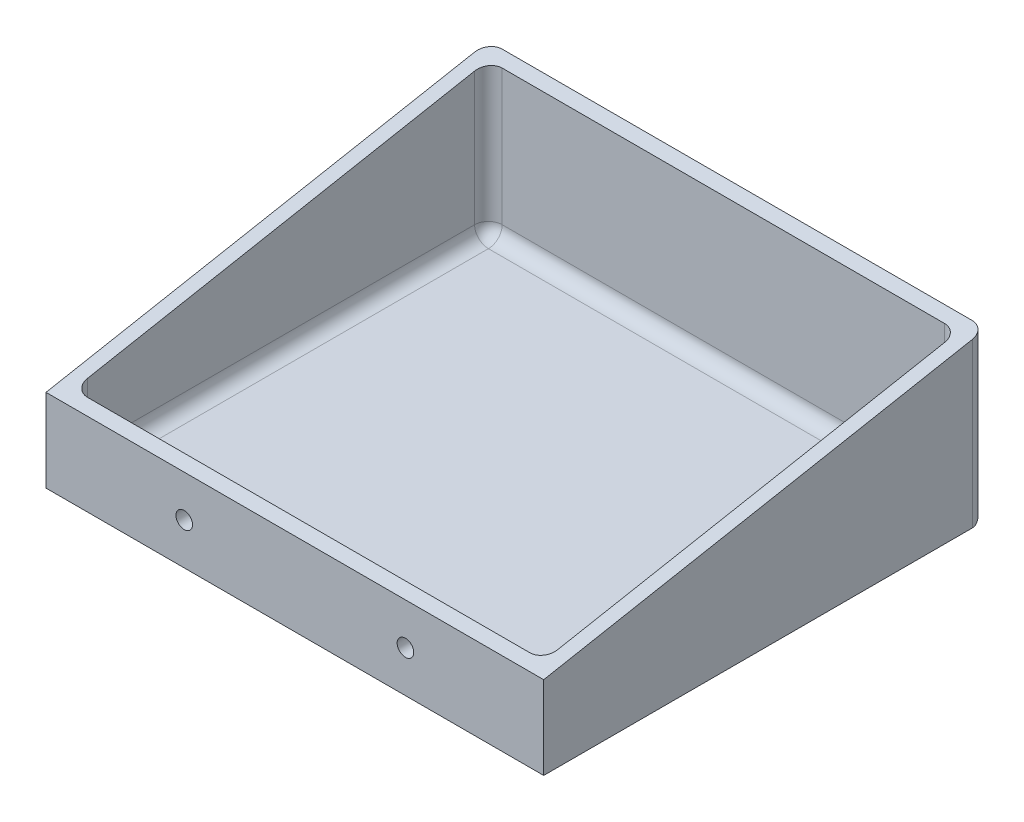
ISO-10303-21;
HEADER;
FILE_DESCRIPTION(('STEP AP214'),'2;1');
FILE_NAME('part.step','',(''),(''),'','','');
FILE_SCHEMA(('AUTOMOTIVE_DESIGN { 1 0 10303 214 1 1 1 1 }'));
ENDSEC;
DATA;
#1=APPLICATION_CONTEXT('core data for automotive mechanical design processes');
#2=APPLICATION_PROTOCOL_DEFINITION('international standard','automotive_design',2000,#1);
#3=PRODUCT_CONTEXT('',#1,'mechanical');
#4=PRODUCT('Part','Part','',(#3));
#5=PRODUCT_RELATED_PRODUCT_CATEGORY('part','',(#4));
#6=PRODUCT_DEFINITION_FORMATION('','',#4);
#7=PRODUCT_DEFINITION_CONTEXT('part definition',#1,'design');
#8=PRODUCT_DEFINITION('design','',#6,#7);
#9=PRODUCT_DEFINITION_SHAPE('','',#8);
#10=(LENGTH_UNIT() NAMED_UNIT(*) SI_UNIT(.MILLI.,.METRE.));
#11=(NAMED_UNIT(*) PLANE_ANGLE_UNIT() SI_UNIT($,.RADIAN.));
#12=(NAMED_UNIT(*) SI_UNIT($,.STERADIAN.) SOLID_ANGLE_UNIT());
#13=UNCERTAINTY_MEASURE_WITH_UNIT(LENGTH_MEASURE(1.E-05),#10,'distance_accuracy_value','');
#14=(GEOMETRIC_REPRESENTATION_CONTEXT(3) GLOBAL_UNCERTAINTY_ASSIGNED_CONTEXT((#13)) GLOBAL_UNIT_ASSIGNED_CONTEXT((#10,
#11,#12)) REPRESENTATION_CONTEXT('',''));
#15=CARTESIAN_POINT('',(0.,0.,0.));
#16=DIRECTION('',(0.,0.,1.));
#17=DIRECTION('',(1.,0.,0.));
#18=AXIS2_PLACEMENT_3D('',#15,#16,#17);
#19=CARTESIAN_POINT('',(90.,15.,0.));
#20=DIRECTION('',(0.,0.,-1.));
#21=DIRECTION('',(0.,1.,0.));
#22=AXIS2_PLACEMENT_3D('',#19,#20,#21);
#23=PLANE('',#22);
#24=DIRECTION('',(0.,-1.,0.));
#25=VECTOR('',#24,1.);
#26=CARTESIAN_POINT('',(0.,15.,0.));
#27=LINE('',#26,#25);
#28=CARTESIAN_POINT('',(0.,15.,0.));
#29=VERTEX_POINT('',#28);
#30=CARTESIAN_POINT('',(0.,0.,0.));
#31=VERTEX_POINT('',#30);
#32=EDGE_CURVE('E184',#29,#31,#27,.T.);
#33=ORIENTED_EDGE('',*,*,#32,.T.);
#34=DIRECTION('',(-1.,0.,0.));
#35=VECTOR('',#34,1.);
#36=CARTESIAN_POINT('',(90.,0.,0.));
#37=LINE('',#36,#35);
#38=CARTESIAN_POINT('',(90.,0.,0.));
#39=VERTEX_POINT('',#38);
#40=EDGE_CURVE('E166',#39,#31,#37,.T.);
#41=ORIENTED_EDGE('',*,*,#40,.F.);
#42=DIRECTION('',(0.,-1.,0.));
#43=VECTOR('',#42,1.);
#44=CARTESIAN_POINT('',(90.,15.,0.));
#45=LINE('',#44,#43);
#46=CARTESIAN_POINT('',(90.,15.,0.));
#47=VERTEX_POINT('',#46);
#48=EDGE_CURVE('E172',#47,#39,#45,.T.);
#49=ORIENTED_EDGE('',*,*,#48,.F.);
#50=DIRECTION('',(-1.,0.,0.));
#51=VECTOR('',#50,1.);
#52=CARTESIAN_POINT('',(90.,15.,0.));
#53=LINE('',#52,#51);
#54=EDGE_CURVE('E193',#47,#29,#53,.T.);
#55=ORIENTED_EDGE('',*,*,#54,.T.);
#56=EDGE_LOOP('',(#33,#41,#49,#55));
#57=FACE_BOUND('',#56,.T.);
#58=CARTESIAN_POINT('',(65.,7.5,0.));
#59=DIRECTION('',(0.,0.,1.));
#60=DIRECTION('',(1.,0.,0.));
#61=AXIS2_PLACEMENT_3D('',#58,#59,#60);
#62=CIRCLE('',#61,1.5);
#63=CARTESIAN_POINT('',(66.5,7.5,0.));
#64=VERTEX_POINT('',#63);
#65=EDGE_CURVE('E330',#64,#64,#62,.T.);
#66=ORIENTED_EDGE('',*,*,#65,.F.);
#67=EDGE_LOOP('',(#66));
#68=FACE_BOUND('',#67,.T.);
#69=CARTESIAN_POINT('',(25.,7.5,0.));
#70=DIRECTION('',(0.,0.,1.));
#71=DIRECTION('',(1.,0.,0.));
#72=AXIS2_PLACEMENT_3D('',#69,#70,#71);
#73=CIRCLE('',#72,1.5);
#74=CARTESIAN_POINT('',(26.5,7.5,0.));
#75=VERTEX_POINT('',#74);
#76=EDGE_CURVE('E677',#75,#75,#73,.T.);
#77=ORIENTED_EDGE('',*,*,#76,.F.);
#78=EDGE_LOOP('',(#77));
#79=FACE_BOUND('',#78,.T.);
#80=ADVANCED_FACE('F45',(#57,#68,#79),#23,.F.);
#81=CARTESIAN_POINT('',(90.,30.,-80.));
#82=DIRECTION('',(0.,-0.982872186934322,-0.184288535050185));
#83=DIRECTION('',(0.,0.184288535050185,-0.982872186934322));
#84=AXIS2_PLACEMENT_3D('',#81,#82,#83);
#85=PLANE('',#84);
#86=DIRECTION('',(-1.,0.,0.));
#87=VECTOR('',#86,1.);
#88=CARTESIAN_POINT('',(90.,30.,-80.));
#89=LINE('',#88,#87);
#90=CARTESIAN_POINT('',(87.5,30.,-80.));
#91=VERTEX_POINT('',#90);
#92=CARTESIAN_POINT('',(2.50000000000003,30.,-80.));
#93=VERTEX_POINT('',#92);
#94=EDGE_CURVE('E187',#91,#93,#89,.T.);
#95=ORIENTED_EDGE('',*,*,#94,.T.);
#96=CARTESIAN_POINT('',(2.5,29.53125,-77.5));
#97=DIRECTION('',(0.,-0.982872186934322,-0.184288535050185));
#98=DIRECTION('',(0.,0.184288535050185,-0.982872186934322));
#99=AXIS2_PLACEMENT_3D('',#96,#97,#98);
#100=ELLIPSE('',#99,2.54356571814058,2.5);
#101=CARTESIAN_POINT('',(0.,29.53125,-77.5));
#102=VERTEX_POINT('',#101);
#103=EDGE_CURVE('E71',#93,#102,#100,.F.);
#104=ORIENTED_EDGE('',*,*,#103,.T.);
#105=DIRECTION('',(0.,-0.184288535050185,0.982872186934322));
#106=VECTOR('',#105,1.);
#107=CARTESIAN_POINT('',(0.,30.,-80.));
#108=LINE('',#107,#106);
#109=EDGE_CURVE('E180',#102,#29,#108,.T.);
#110=ORIENTED_EDGE('',*,*,#109,.T.);
#111=ORIENTED_EDGE('',*,*,#54,.F.);
#112=DIRECTION('',(0.,-0.184288535050185,0.982872186934322));
#113=VECTOR('',#112,1.);
#114=CARTESIAN_POINT('',(90.,30.,-80.));
#115=LINE('',#114,#113);
#116=CARTESIAN_POINT('',(90.,29.53125,-77.5));
#117=VERTEX_POINT('',#116);
#118=EDGE_CURVE('E171',#117,#47,#115,.T.);
#119=ORIENTED_EDGE('',*,*,#118,.F.);
#120=CARTESIAN_POINT('',(87.5,29.53125,-77.5));
#121=DIRECTION('',(0.,-0.982872186934322,-0.184288535050185));
#122=DIRECTION('',(0.,-0.184288535050185,0.982872186934322));
#123=AXIS2_PLACEMENT_3D('',#120,#121,#122);
#124=ELLIPSE('',#123,2.54356571814058,2.5);
#125=EDGE_CURVE('E255',#117,#91,#124,.F.);
#126=ORIENTED_EDGE('',*,*,#125,.T.);
#127=EDGE_LOOP('',(#95,#104,#110,#111,#119,#126));
#128=FACE_BOUND('',#127,.T.);
#129=DIRECTION('',(0.,-0.184288535050185,0.982872186934322));
#130=VECTOR('',#129,1.);
#131=CARTESIAN_POINT('',(2.5,30.,-80.));
#132=LINE('',#131,#130);
#133=CARTESIAN_POINT('',(2.5,29.0625,-75.));
#134=VERTEX_POINT('',#133);
#135=CARTESIAN_POINT('',(2.5,15.9375,-4.99999999999998));
#136=VERTEX_POINT('',#135);
#137=EDGE_CURVE('E318',#134,#136,#132,.T.);
#138=ORIENTED_EDGE('',*,*,#137,.F.);
#139=CARTESIAN_POINT('',(5.,29.0625,-75.));
#140=DIRECTION('',(0.,-0.982872186934322,-0.184288535050185));
#141=DIRECTION('',(0.,-0.184288535050185,0.982872186934322));
#142=AXIS2_PLACEMENT_3D('',#139,#140,#141);
#143=ELLIPSE('',#142,2.54356571814058,2.5);
#144=CARTESIAN_POINT('',(5.,29.53125,-77.5));
#145=VERTEX_POINT('',#144);
#146=EDGE_CURVE('E55',#134,#145,#143,.T.);
#147=ORIENTED_EDGE('',*,*,#146,.T.);
#148=DIRECTION('',(-1.,0.,0.));
#149=VECTOR('',#148,1.);
#150=CARTESIAN_POINT('',(90.,29.53125,-77.5));
#151=LINE('',#150,#149);
#152=CARTESIAN_POINT('',(85.,29.53125,-77.5));
#153=VERTEX_POINT('',#152);
#154=EDGE_CURVE('E344',#153,#145,#151,.T.);
#155=ORIENTED_EDGE('',*,*,#154,.F.);
#156=CARTESIAN_POINT('',(85.,29.0625,-75.));
#157=DIRECTION('',(0.,-0.982872186934322,-0.184288535050185));
#158=DIRECTION('',(0.,0.184288535050185,-0.982872186934322));
#159=AXIS2_PLACEMENT_3D('',#156,#157,#158);
#160=ELLIPSE('',#159,2.54356571814058,2.5);
#161=CARTESIAN_POINT('',(87.5,29.0625,-75.));
#162=VERTEX_POINT('',#161);
#163=EDGE_CURVE('E11',#153,#162,#160,.T.);
#164=ORIENTED_EDGE('',*,*,#163,.T.);
#165=DIRECTION('',(0.,-0.184288535050185,0.982872186934322));
#166=VECTOR('',#165,1.);
#167=CARTESIAN_POINT('',(87.5,30.,-80.));
#168=LINE('',#167,#166);
#169=CARTESIAN_POINT('',(87.5,15.9375,-4.99999999999998));
#170=VERTEX_POINT('',#169);
#171=EDGE_CURVE('E345',#162,#170,#168,.T.);
#172=ORIENTED_EDGE('',*,*,#171,.T.);
#173=CARTESIAN_POINT('',(85.,15.9375,-5.));
#174=DIRECTION('',(0.,-0.982872186934322,-0.184288535050185));
#175=DIRECTION('',(0.,-0.184288535050185,0.982872186934322));
#176=AXIS2_PLACEMENT_3D('',#173,#174,#175);
#177=ELLIPSE('',#176,2.54356571814058,2.5);
#178=CARTESIAN_POINT('',(85.,15.46875,-2.5));
#179=VERTEX_POINT('',#178);
#180=EDGE_CURVE('E265',#170,#179,#177,.T.);
#181=ORIENTED_EDGE('',*,*,#180,.T.);
#182=DIRECTION('',(-1.,0.,0.));
#183=VECTOR('',#182,1.);
#184=CARTESIAN_POINT('',(90.,15.46875,-2.5));
#185=LINE('',#184,#183);
#186=CARTESIAN_POINT('',(5.,15.46875,-2.5));
#187=VERTEX_POINT('',#186);
#188=EDGE_CURVE('E340',#179,#187,#185,.T.);
#189=ORIENTED_EDGE('',*,*,#188,.T.);
#190=CARTESIAN_POINT('',(5.,15.9375,-5.));
#191=DIRECTION('',(0.,-0.982872186934322,-0.184288535050185));
#192=DIRECTION('',(0.,0.184288535050185,-0.982872186934322));
#193=AXIS2_PLACEMENT_3D('',#190,#191,#192);
#194=ELLIPSE('',#193,2.54356571814058,2.5);
#195=EDGE_CURVE('E268',#187,#136,#194,.T.);
#196=ORIENTED_EDGE('',*,*,#195,.T.);
#197=EDGE_LOOP('',(#138,#147,#155,#164,#172,#181,#189,#196));
#198=FACE_BOUND('',#197,.T.);
#199=ADVANCED_FACE('F377',(#128,#198),#85,.F.);
#200=CARTESIAN_POINT('',(90.,0.,0.));
#201=DIRECTION('',(0.,1.,0.));
#202=DIRECTION('',(0.,0.,1.));
#203=AXIS2_PLACEMENT_3D('',#200,#201,#202);
#204=PLANE('',#203);
#205=DIRECTION('',(0.,0.,-1.));
#206=VECTOR('',#205,1.);
#207=CARTESIAN_POINT('',(0.,0.,0.));
#208=LINE('',#207,#206);
#209=CARTESIAN_POINT('',(0.,0.,-77.5));
#210=VERTEX_POINT('',#209);
#211=EDGE_CURVE('E359',#31,#210,#208,.T.);
#212=ORIENTED_EDGE('',*,*,#211,.T.);
#213=DIRECTION('',(-1.,0.,0.));
#214=VECTOR('',#213,1.);
#215=CARTESIAN_POINT('',(90.,0.,-77.5));
#216=LINE('',#215,#214);
#217=CARTESIAN_POINT('',(90.,0.,-77.5));
#218=VERTEX_POINT('',#217);
#219=EDGE_CURVE('E169',#210,#218,#216,.F.);
#220=ORIENTED_EDGE('',*,*,#219,.T.);
#221=DIRECTION('',(0.,0.,-1.));
#222=VECTOR('',#221,1.);
#223=CARTESIAN_POINT('',(90.,0.,0.));
#224=LINE('',#223,#222);
#225=EDGE_CURVE('E161',#39,#218,#224,.T.);
#226=ORIENTED_EDGE('',*,*,#225,.F.);
#227=ORIENTED_EDGE('',*,*,#40,.T.);
#228=EDGE_LOOP('',(#212,#220,#226,#227));
#229=FACE_BOUND('',#228,.T.);
#230=ADVANCED_FACE('F164',(#229),#204,.F.);
#231=CARTESIAN_POINT('',(90.,0.,-80.));
#232=DIRECTION('',(0.,0.,1.));
#233=DIRECTION('',(1.,0.,0.));
#234=AXIS2_PLACEMENT_3D('',#231,#232,#233);
#235=PLANE('',#234);
#236=DIRECTION('',(-1.,0.,0.));
#237=VECTOR('',#236,1.);
#238=CARTESIAN_POINT('',(90.,2.5,-80.));
#239=LINE('',#238,#237);
#240=CARTESIAN_POINT('',(87.5,2.5,-80.));
#241=VERTEX_POINT('',#240);
#242=CARTESIAN_POINT('',(2.5,2.5,-80.));
#243=VERTEX_POINT('',#242);
#244=EDGE_CURVE('E246',#241,#243,#239,.T.);
#245=ORIENTED_EDGE('',*,*,#244,.T.);
#246=DIRECTION('',(0.,1.,0.));
#247=VECTOR('',#246,1.);
#248=CARTESIAN_POINT('',(2.5,0.,-80.));
#249=LINE('',#248,#247);
#250=EDGE_CURVE('E250',#243,#93,#249,.T.);
#251=ORIENTED_EDGE('',*,*,#250,.T.);
#252=ORIENTED_EDGE('',*,*,#94,.F.);
#253=DIRECTION('',(0.,1.,0.));
#254=VECTOR('',#253,1.);
#255=CARTESIAN_POINT('',(87.5,0.,-80.));
#256=LINE('',#255,#254);
#257=EDGE_CURVE('E243',#91,#241,#256,.F.);
#258=ORIENTED_EDGE('',*,*,#257,.T.);
#259=EDGE_LOOP('',(#245,#251,#252,#258));
#260=FACE_BOUND('',#259,.T.);
#261=ADVANCED_FACE('F373',(#260),#235,.F.);
#262=CARTESIAN_POINT('',(90.,0.,0.));
#263=DIRECTION('',(1.,0.,0.));
#264=DIRECTION('',(0.,0.,-1.));
#265=AXIS2_PLACEMENT_3D('',#262,#263,#264);
#266=PLANE('',#265);
#267=ORIENTED_EDGE('',*,*,#225,.T.);
#268=DIRECTION('',(0.,1.,0.));
#269=VECTOR('',#268,1.);
#270=CARTESIAN_POINT('',(90.,30.,-77.5));
#271=LINE('',#270,#269);
#272=EDGE_CURVE('E63',#218,#117,#271,.T.);
#273=ORIENTED_EDGE('',*,*,#272,.T.);
#274=ORIENTED_EDGE('',*,*,#118,.T.);
#275=ORIENTED_EDGE('',*,*,#48,.T.);
#276=EDGE_LOOP('',(#267,#273,#274,#275));
#277=FACE_BOUND('',#276,.T.);
#278=ADVANCED_FACE('F175',(#277),#266,.T.);
#279=CARTESIAN_POINT('',(0.,0.,0.));
#280=DIRECTION('',(1.,0.,0.));
#281=DIRECTION('',(0.,0.,-1.));
#282=AXIS2_PLACEMENT_3D('',#279,#280,#281);
#283=PLANE('',#282);
#284=ORIENTED_EDGE('',*,*,#109,.F.);
#285=DIRECTION('',(0.,1.,0.));
#286=VECTOR('',#285,1.);
#287=CARTESIAN_POINT('',(0.,0.,-77.5));
#288=LINE('',#287,#286);
#289=EDGE_CURVE('E260',#102,#210,#288,.F.);
#290=ORIENTED_EDGE('',*,*,#289,.T.);
#291=ORIENTED_EDGE('',*,*,#211,.F.);
#292=ORIENTED_EDGE('',*,*,#32,.F.);
#293=EDGE_LOOP('',(#284,#290,#291,#292));
#294=FACE_BOUND('',#293,.T.);
#295=ADVANCED_FACE('F365',(#294),#283,.F.);
#296=CARTESIAN_POINT('',(90.,15.,-2.5));
#297=DIRECTION('',(0.,0.,-1.));
#298=DIRECTION('',(0.,1.,0.));
#299=AXIS2_PLACEMENT_3D('',#296,#297,#298);
#300=PLANE('',#299);
#301=CARTESIAN_POINT('',(25.,7.5,-2.5));
#302=DIRECTION('',(0.,0.,-1.));
#303=DIRECTION('',(0.,1.,0.));
#304=AXIS2_PLACEMENT_3D('',#301,#302,#303);
#305=CIRCLE('',#304,1.5);
#306=CARTESIAN_POINT('',(25.,9.,-2.5));
#307=VERTEX_POINT('',#306);
#308=EDGE_CURVE('E336',#307,#307,#305,.T.);
#309=ORIENTED_EDGE('',*,*,#308,.F.);
#310=EDGE_LOOP('',(#309));
#311=FACE_BOUND('',#310,.T.);
#312=CARTESIAN_POINT('',(65.,7.5,-2.5));
#313=DIRECTION('',(0.,0.,-1.));
#314=DIRECTION('',(0.,1.,0.));
#315=AXIS2_PLACEMENT_3D('',#312,#313,#314);
#316=CIRCLE('',#315,1.5);
#317=CARTESIAN_POINT('',(65.,9.,-2.5));
#318=VERTEX_POINT('',#317);
#319=EDGE_CURVE('E321',#318,#318,#316,.T.);
#320=ORIENTED_EDGE('',*,*,#319,.F.);
#321=EDGE_LOOP('',(#320));
#322=FACE_BOUND('',#321,.T.);
#323=ORIENTED_EDGE('',*,*,#188,.F.);
#324=DIRECTION('',(0.,-1.,0.));
#325=VECTOR('',#324,1.);
#326=CARTESIAN_POINT('',(85.,15.,-2.5));
#327=LINE('',#326,#325);
#328=CARTESIAN_POINT('',(85.,5.,-2.5));
#329=VERTEX_POINT('',#328);
#330=EDGE_CURVE('E231',#179,#329,#327,.T.);
#331=ORIENTED_EDGE('',*,*,#330,.T.);
#332=DIRECTION('',(-1.,0.,0.));
#333=VECTOR('',#332,1.);
#334=CARTESIAN_POINT('',(2.5,5.,-2.5));
#335=LINE('',#334,#333);
#336=CARTESIAN_POINT('',(5.,5.,-2.5));
#337=VERTEX_POINT('',#336);
#338=EDGE_CURVE('E228',#329,#337,#335,.T.);
#339=ORIENTED_EDGE('',*,*,#338,.T.);
#340=DIRECTION('',(0.,-1.,0.));
#341=VECTOR('',#340,1.);
#342=CARTESIAN_POINT('',(5.,15.46875,-2.5));
#343=LINE('',#342,#341);
#344=EDGE_CURVE('E225',#337,#187,#343,.F.);
#345=ORIENTED_EDGE('',*,*,#344,.T.);
#346=EDGE_LOOP('',(#323,#331,#339,#345));
#347=FACE_BOUND('',#346,.T.);
#348=ADVANCED_FACE('F423',(#311,#322,#347),#300,.T.);
#349=CARTESIAN_POINT('',(90.,2.5,0.));
#350=DIRECTION('',(0.,1.,0.));
#351=DIRECTION('',(0.,0.,1.));
#352=AXIS2_PLACEMENT_3D('',#349,#350,#351);
#353=PLANE('',#352);
#354=DIRECTION('',(0.,0.,-1.));
#355=VECTOR('',#354,1.);
#356=CARTESIAN_POINT('',(85.,2.5,0.));
#357=LINE('',#356,#355);
#358=CARTESIAN_POINT('',(85.,2.5,-5.));
#359=VERTEX_POINT('',#358);
#360=CARTESIAN_POINT('',(85.,2.5,-75.));
#361=VERTEX_POINT('',#360);
#362=EDGE_CURVE('E199',#359,#361,#357,.T.);
#363=ORIENTED_EDGE('',*,*,#362,.T.);
#364=DIRECTION('',(-1.,0.,0.));
#365=VECTOR('',#364,1.);
#366=CARTESIAN_POINT('',(2.5,2.5,-75.));
#367=LINE('',#366,#365);
#368=CARTESIAN_POINT('',(5.,2.5,-75.));
#369=VERTEX_POINT('',#368);
#370=EDGE_CURVE('E202',#361,#369,#367,.T.);
#371=ORIENTED_EDGE('',*,*,#370,.T.);
#372=DIRECTION('',(0.,0.,-1.));
#373=VECTOR('',#372,1.);
#374=CARTESIAN_POINT('',(5.,2.5,-2.5));
#375=LINE('',#374,#373);
#376=CARTESIAN_POINT('',(5.,2.5,-5.));
#377=VERTEX_POINT('',#376);
#378=EDGE_CURVE('E186',#369,#377,#375,.F.);
#379=ORIENTED_EDGE('',*,*,#378,.T.);
#380=DIRECTION('',(-1.,0.,0.));
#381=VECTOR('',#380,1.);
#382=CARTESIAN_POINT('',(87.5,2.5,-5.));
#383=LINE('',#382,#381);
#384=EDGE_CURVE('E191',#377,#359,#383,.F.);
#385=ORIENTED_EDGE('',*,*,#384,.T.);
#386=EDGE_LOOP('',(#363,#371,#379,#385));
#387=FACE_BOUND('',#386,.T.);
#388=ADVANCED_FACE('F574',(#387),#353,.T.);
#389=CARTESIAN_POINT('',(90.,0.,-77.5));
#390=DIRECTION('',(0.,0.,1.));
#391=DIRECTION('',(1.,0.,0.));
#392=AXIS2_PLACEMENT_3D('',#389,#390,#391);
#393=PLANE('',#392);
#394=ORIENTED_EDGE('',*,*,#154,.T.);
#395=DIRECTION('',(0.,1.,0.));
#396=VECTOR('',#395,1.);
#397=CARTESIAN_POINT('',(5.,2.5,-77.5));
#398=LINE('',#397,#396);
#399=CARTESIAN_POINT('',(5.,5.,-77.5));
#400=VERTEX_POINT('',#399);
#401=EDGE_CURVE('E213',#145,#400,#398,.F.);
#402=ORIENTED_EDGE('',*,*,#401,.T.);
#403=DIRECTION('',(-1.,0.,0.));
#404=VECTOR('',#403,1.);
#405=CARTESIAN_POINT('',(87.5,5.,-77.5));
#406=LINE('',#405,#404);
#407=CARTESIAN_POINT('',(85.,5.,-77.5));
#408=VERTEX_POINT('',#407);
#409=EDGE_CURVE('E209',#400,#408,#406,.F.);
#410=ORIENTED_EDGE('',*,*,#409,.T.);
#411=DIRECTION('',(0.,1.,0.));
#412=VECTOR('',#411,1.);
#413=CARTESIAN_POINT('',(85.,0.,-77.5));
#414=LINE('',#413,#412);
#415=EDGE_CURVE('E206',#408,#153,#414,.T.);
#416=ORIENTED_EDGE('',*,*,#415,.T.);
#417=EDGE_LOOP('',(#394,#402,#410,#416));
#418=FACE_BOUND('',#417,.T.);
#419=ADVANCED_FACE('F395',(#418),#393,.T.);
#420=CARTESIAN_POINT('',(87.5,0.,0.));
#421=DIRECTION('',(1.,0.,0.));
#422=DIRECTION('',(0.,0.,-1.));
#423=AXIS2_PLACEMENT_3D('',#420,#421,#422);
#424=PLANE('',#423);
#425=DIRECTION('',(0.,0.,-1.));
#426=VECTOR('',#425,1.);
#427=CARTESIAN_POINT('',(87.5,5.,0.));
#428=LINE('',#427,#426);
#429=CARTESIAN_POINT('',(87.5,5.,-75.));
#430=VERTEX_POINT('',#429);
#431=CARTESIAN_POINT('',(87.5,5.,-5.));
#432=VERTEX_POINT('',#431);
#433=EDGE_CURVE('E219',#430,#432,#428,.F.);
#434=ORIENTED_EDGE('',*,*,#433,.T.);
#435=DIRECTION('',(0.,-1.,0.));
#436=VECTOR('',#435,1.);
#437=CARTESIAN_POINT('',(87.5,0.,-5.));
#438=LINE('',#437,#436);
#439=EDGE_CURVE('E222',#432,#170,#438,.F.);
#440=ORIENTED_EDGE('',*,*,#439,.T.);
#441=ORIENTED_EDGE('',*,*,#171,.F.);
#442=DIRECTION('',(0.,1.,0.));
#443=VECTOR('',#442,1.);
#444=CARTESIAN_POINT('',(87.5,0.,-75.));
#445=LINE('',#444,#443);
#446=EDGE_CURVE('E216',#162,#430,#445,.F.);
#447=ORIENTED_EDGE('',*,*,#446,.T.);
#448=EDGE_LOOP('',(#434,#440,#441,#447));
#449=FACE_BOUND('',#448,.T.);
#450=ADVANCED_FACE('F405',(#449),#424,.F.);
#451=CARTESIAN_POINT('',(2.5,0.,0.));
#452=DIRECTION('',(1.,0.,0.));
#453=DIRECTION('',(0.,0.,-1.));
#454=AXIS2_PLACEMENT_3D('',#451,#452,#453);
#455=PLANE('',#454);
#456=ORIENTED_EDGE('',*,*,#137,.T.);
#457=DIRECTION('',(0.,-1.,0.));
#458=VECTOR('',#457,1.);
#459=CARTESIAN_POINT('',(2.5,2.5,-5.));
#460=LINE('',#459,#458);
#461=CARTESIAN_POINT('',(2.5,5.,-5.));
#462=VERTEX_POINT('',#461);
#463=EDGE_CURVE('E240',#136,#462,#460,.T.);
#464=ORIENTED_EDGE('',*,*,#463,.T.);
#465=DIRECTION('',(0.,0.,-1.));
#466=VECTOR('',#465,1.);
#467=CARTESIAN_POINT('',(2.5,5.,-77.5));
#468=LINE('',#467,#466);
#469=CARTESIAN_POINT('',(2.5,5.,-75.));
#470=VERTEX_POINT('',#469);
#471=EDGE_CURVE('E237',#462,#470,#468,.T.);
#472=ORIENTED_EDGE('',*,*,#471,.T.);
#473=DIRECTION('',(0.,1.,0.));
#474=VECTOR('',#473,1.);
#475=CARTESIAN_POINT('',(2.5,29.53125,-75.));
#476=LINE('',#475,#474);
#477=EDGE_CURVE('E234',#470,#134,#476,.T.);
#478=ORIENTED_EDGE('',*,*,#477,.T.);
#479=EDGE_LOOP('',(#456,#464,#472,#478));
#480=FACE_BOUND('',#479,.T.);
#481=ADVANCED_FACE('F440',(#480),#455,.T.);
#482=CARTESIAN_POINT('',(85.,15.,-5.));
#483=DIRECTION('',(0.,-1.,0.));
#484=DIRECTION('',(0.,0.,-1.));
#485=AXIS2_PLACEMENT_3D('',#482,#483,#484);
#486=CYLINDRICAL_SURFACE('',#485,2.5);
#487=ORIENTED_EDGE('',*,*,#180,.F.);
#488=ORIENTED_EDGE('',*,*,#439,.F.);
#489=CARTESIAN_POINT('',(85.,5.,-5.));
#490=DIRECTION('',(0.,1.,0.));
#491=DIRECTION('',(-1.,0.,0.));
#492=AXIS2_PLACEMENT_3D('',#489,#490,#491);
#493=CIRCLE('',#492,2.5);
#494=EDGE_CURVE('E315',#329,#432,#493,.T.);
#495=ORIENTED_EDGE('',*,*,#494,.F.);
#496=ORIENTED_EDGE('',*,*,#330,.F.);
#497=EDGE_LOOP('',(#487,#488,#495,#496));
#498=FACE_BOUND('',#497,.T.);
#499=ADVANCED_FACE('F420',(#498),#486,.F.);
#500=CARTESIAN_POINT('',(90.,5.,-5.));
#501=DIRECTION('',(1.,0.,0.));
#502=DIRECTION('',(0.,0.,-1.));
#503=AXIS2_PLACEMENT_3D('',#500,#501,#502);
#504=CYLINDRICAL_SURFACE('',#503,2.5);
#505=CARTESIAN_POINT('',(5.,5.,-5.));
#506=DIRECTION('',(1.,0.,0.));
#507=DIRECTION('',(0.,0.,-1.));
#508=AXIS2_PLACEMENT_3D('',#505,#506,#507);
#509=CIRCLE('',#508,2.5);
#510=EDGE_CURVE('E307',#337,#377,#509,.T.);
#511=ORIENTED_EDGE('',*,*,#510,.F.);
#512=ORIENTED_EDGE('',*,*,#338,.F.);
#513=CARTESIAN_POINT('',(85.,5.,-5.));
#514=DIRECTION('',(-1.,0.,0.));
#515=DIRECTION('',(0.,0.,1.));
#516=AXIS2_PLACEMENT_3D('',#513,#514,#515);
#517=CIRCLE('',#516,2.5);
#518=EDGE_CURVE('E311',#359,#329,#517,.T.);
#519=ORIENTED_EDGE('',*,*,#518,.F.);
#520=ORIENTED_EDGE('',*,*,#384,.F.);
#521=EDGE_LOOP('',(#511,#512,#519,#520));
#522=FACE_BOUND('',#521,.T.);
#523=ADVANCED_FACE('F433',(#522),#504,.F.);
#524=CARTESIAN_POINT('',(5.,0.,-5.));
#525=DIRECTION('',(0.,1.,0.));
#526=DIRECTION('',(0.,0.,1.));
#527=AXIS2_PLACEMENT_3D('',#524,#525,#526);
#528=CYLINDRICAL_SURFACE('',#527,2.5);
#529=ORIENTED_EDGE('',*,*,#195,.F.);
#530=ORIENTED_EDGE('',*,*,#344,.F.);
#531=CARTESIAN_POINT('',(5.,5.,-5.));
#532=DIRECTION('',(0.,1.,0.));
#533=DIRECTION('',(0.,0.,1.));
#534=AXIS2_PLACEMENT_3D('',#531,#532,#533);
#535=CIRCLE('',#534,2.5);
#536=EDGE_CURVE('E303',#462,#337,#535,.T.);
#537=ORIENTED_EDGE('',*,*,#536,.F.);
#538=ORIENTED_EDGE('',*,*,#463,.F.);
#539=EDGE_LOOP('',(#529,#530,#537,#538));
#540=FACE_BOUND('',#539,.T.);
#541=ADVANCED_FACE('F429',(#540),#528,.F.);
#542=CARTESIAN_POINT('',(85.,5.,-5.));
#543=DIRECTION('',(0.,0.,1.));
#544=DIRECTION('',(0.,-1.,0.));
#545=AXIS2_PLACEMENT_3D('',#542,#543,#544);
#546=SPHERICAL_SURFACE('',#545,2.5);
#547=ORIENTED_EDGE('',*,*,#518,.T.);
#548=ORIENTED_EDGE('',*,*,#494,.T.);
#549=CARTESIAN_POINT('',(85.,5.,-5.));
#550=DIRECTION('',(0.,0.,-1.));
#551=DIRECTION('',(-1.,0.,0.));
#552=AXIS2_PLACEMENT_3D('',#549,#550,#551);
#553=CIRCLE('',#552,2.5);
#554=EDGE_CURVE('E299',#359,#432,#553,.F.);
#555=ORIENTED_EDGE('',*,*,#554,.F.);
#556=EDGE_LOOP('',(#547,#548,#555));
#557=FACE_BOUND('',#556,.T.);
#558=ADVANCED_FACE('F414',(#557),#546,.F.);
#559=CARTESIAN_POINT('',(5.,5.,-5.));
#560=DIRECTION('',(0.,0.,1.));
#561=DIRECTION('',(0.,-1.,0.));
#562=AXIS2_PLACEMENT_3D('',#559,#560,#561);
#563=SPHERICAL_SURFACE('',#562,2.5);
#564=ORIENTED_EDGE('',*,*,#536,.T.);
#565=ORIENTED_EDGE('',*,*,#510,.T.);
#566=CARTESIAN_POINT('',(5.,5.,-5.));
#567=DIRECTION('',(0.,0.,-1.));
#568=DIRECTION('',(-1.,0.,0.));
#569=AXIS2_PLACEMENT_3D('',#566,#567,#568);
#570=CIRCLE('',#569,2.5);
#571=EDGE_CURVE('E295',#462,#377,#570,.F.);
#572=ORIENTED_EDGE('',*,*,#571,.F.);
#573=EDGE_LOOP('',(#564,#565,#572));
#574=FACE_BOUND('',#573,.T.);
#575=ADVANCED_FACE('F435',(#574),#563,.F.);
#576=CARTESIAN_POINT('',(85.,0.,-75.));
#577=DIRECTION('',(0.,1.,0.));
#578=DIRECTION('',(0.,0.,1.));
#579=AXIS2_PLACEMENT_3D('',#576,#577,#578);
#580=CYLINDRICAL_SURFACE('',#579,2.5);
#581=ORIENTED_EDGE('',*,*,#163,.F.);
#582=ORIENTED_EDGE('',*,*,#415,.F.);
#583=CARTESIAN_POINT('',(85.,5.,-75.));
#584=DIRECTION('',(0.,1.,0.));
#585=DIRECTION('',(0.,0.,1.));
#586=AXIS2_PLACEMENT_3D('',#583,#584,#585);
#587=CIRCLE('',#586,2.5);
#588=EDGE_CURVE('E291',#430,#408,#587,.T.);
#589=ORIENTED_EDGE('',*,*,#588,.F.);
#590=ORIENTED_EDGE('',*,*,#446,.F.);
#591=EDGE_LOOP('',(#581,#582,#589,#590));
#592=FACE_BOUND('',#591,.T.);
#593=ADVANCED_FACE('F401',(#592),#580,.F.);
#594=CARTESIAN_POINT('',(85.,5.,0.));
#595=DIRECTION('',(0.,0.,-1.));
#596=DIRECTION('',(-1.,0.,0.));
#597=AXIS2_PLACEMENT_3D('',#594,#595,#596);
#598=CYLINDRICAL_SURFACE('',#597,2.5);
#599=ORIENTED_EDGE('',*,*,#554,.T.);
#600=ORIENTED_EDGE('',*,*,#433,.F.);
#601=CARTESIAN_POINT('',(85.,5.,-75.));
#602=DIRECTION('',(0.,0.,1.));
#603=DIRECTION('',(1.,0.,0.));
#604=AXIS2_PLACEMENT_3D('',#601,#602,#603);
#605=CIRCLE('',#604,2.5);
#606=EDGE_CURVE('E287',#361,#430,#605,.T.);
#607=ORIENTED_EDGE('',*,*,#606,.F.);
#608=ORIENTED_EDGE('',*,*,#362,.F.);
#609=EDGE_LOOP('',(#599,#600,#607,#608));
#610=FACE_BOUND('',#609,.T.);
#611=ADVANCED_FACE('F409',(#610),#598,.F.);
#612=CARTESIAN_POINT('',(5.,5.,0.));
#613=DIRECTION('',(0.,0.,1.));
#614=DIRECTION('',(1.,0.,0.));
#615=AXIS2_PLACEMENT_3D('',#612,#613,#614);
#616=CYLINDRICAL_SURFACE('',#615,2.5);
#617=ORIENTED_EDGE('',*,*,#571,.T.);
#618=ORIENTED_EDGE('',*,*,#378,.F.);
#619=CARTESIAN_POINT('',(5.,5.,-75.));
#620=DIRECTION('',(0.,0.,1.));
#621=DIRECTION('',(0.,-1.,0.));
#622=AXIS2_PLACEMENT_3D('',#619,#620,#621);
#623=CIRCLE('',#622,2.5);
#624=EDGE_CURVE('E283',#470,#369,#623,.T.);
#625=ORIENTED_EDGE('',*,*,#624,.F.);
#626=ORIENTED_EDGE('',*,*,#471,.F.);
#627=EDGE_LOOP('',(#617,#618,#625,#626));
#628=FACE_BOUND('',#627,.T.);
#629=ADVANCED_FACE('F439',(#628),#616,.F.);
#630=CARTESIAN_POINT('',(5.,0.,-75.));
#631=DIRECTION('',(0.,-1.,0.));
#632=DIRECTION('',(0.,0.,-1.));
#633=AXIS2_PLACEMENT_3D('',#630,#631,#632);
#634=CYLINDRICAL_SURFACE('',#633,2.5);
#635=ORIENTED_EDGE('',*,*,#146,.F.);
#636=ORIENTED_EDGE('',*,*,#477,.F.);
#637=CARTESIAN_POINT('',(5.,5.,-75.));
#638=DIRECTION('',(0.,1.,0.));
#639=DIRECTION('',(0.,0.,1.));
#640=AXIS2_PLACEMENT_3D('',#637,#638,#639);
#641=CIRCLE('',#640,2.5);
#642=EDGE_CURVE('E279',#400,#470,#641,.T.);
#643=ORIENTED_EDGE('',*,*,#642,.F.);
#644=ORIENTED_EDGE('',*,*,#401,.F.);
#645=EDGE_LOOP('',(#635,#636,#643,#644));
#646=FACE_BOUND('',#645,.T.);
#647=ADVANCED_FACE('F390',(#646),#634,.F.);
#648=CARTESIAN_POINT('',(85.,5.,-75.));
#649=DIRECTION('',(1.,0.,0.));
#650=DIRECTION('',(0.,0.,-1.));
#651=AXIS2_PLACEMENT_3D('',#648,#649,#650);
#652=SPHERICAL_SURFACE('',#651,2.5);
#653=ORIENTED_EDGE('',*,*,#606,.T.);
#654=ORIENTED_EDGE('',*,*,#588,.T.);
#655=CARTESIAN_POINT('',(85.,5.,-75.));
#656=DIRECTION('',(-1.,0.,0.));
#657=DIRECTION('',(0.,0.,1.));
#658=AXIS2_PLACEMENT_3D('',#655,#656,#657);
#659=CIRCLE('',#658,2.5);
#660=EDGE_CURVE('E276',#361,#408,#659,.F.);
#661=ORIENTED_EDGE('',*,*,#660,.F.);
#662=EDGE_LOOP('',(#653,#654,#661));
#663=FACE_BOUND('',#662,.T.);
#664=ADVANCED_FACE('F466',(#663),#652,.F.);
#665=CARTESIAN_POINT('',(5.,5.,-75.));
#666=DIRECTION('',(-1.,0.,0.));
#667=DIRECTION('',(0.,0.,1.));
#668=AXIS2_PLACEMENT_3D('',#665,#666,#667);
#669=SPHERICAL_SURFACE('',#668,2.5);
#670=ORIENTED_EDGE('',*,*,#642,.T.);
#671=ORIENTED_EDGE('',*,*,#624,.T.);
#672=CARTESIAN_POINT('',(5.,5.,-75.));
#673=DIRECTION('',(1.,0.,0.));
#674=DIRECTION('',(0.,0.,-1.));
#675=AXIS2_PLACEMENT_3D('',#672,#673,#674);
#676=CIRCLE('',#675,2.5);
#677=EDGE_CURVE('E273',#400,#369,#676,.F.);
#678=ORIENTED_EDGE('',*,*,#677,.F.);
#679=EDGE_LOOP('',(#670,#671,#678));
#680=FACE_BOUND('',#679,.T.);
#681=ADVANCED_FACE('F462',(#680),#669,.F.);
#682=CARTESIAN_POINT('',(90.,5.,-75.));
#683=DIRECTION('',(1.,0.,0.));
#684=DIRECTION('',(0.,0.,-1.));
#685=AXIS2_PLACEMENT_3D('',#682,#683,#684);
#686=CYLINDRICAL_SURFACE('',#685,2.5);
#687=ORIENTED_EDGE('',*,*,#660,.T.);
#688=ORIENTED_EDGE('',*,*,#409,.F.);
#689=ORIENTED_EDGE('',*,*,#677,.T.);
#690=ORIENTED_EDGE('',*,*,#370,.F.);
#691=EDGE_LOOP('',(#687,#688,#689,#690));
#692=FACE_BOUND('',#691,.T.);
#693=ADVANCED_FACE('F459',(#692),#686,.F.);
#694=CARTESIAN_POINT('',(87.5,0.,-77.5));
#695=DIRECTION('',(0.,-1.,0.));
#696=DIRECTION('',(0.,0.,-1.));
#697=AXIS2_PLACEMENT_3D('',#694,#695,#696);
#698=CYLINDRICAL_SURFACE('',#697,2.5);
#699=ORIENTED_EDGE('',*,*,#125,.F.);
#700=ORIENTED_EDGE('',*,*,#272,.F.);
#701=CARTESIAN_POINT('',(87.5,2.5,-77.5));
#702=DIRECTION('',(-0.707106781186547,-0.707106781186547,0.));
#703=DIRECTION('',(0.707106781186547,-0.707106781186547,0.));
#704=AXIS2_PLACEMENT_3D('',#701,#702,#703);
#705=ELLIPSE('',#704,3.53553390593274,2.5);
#706=EDGE_CURVE('E49',#241,#218,#705,.T.);
#707=ORIENTED_EDGE('',*,*,#706,.F.);
#708=ORIENTED_EDGE('',*,*,#257,.F.);
#709=EDGE_LOOP('',(#699,#700,#707,#708));
#710=FACE_BOUND('',#709,.T.);
#711=ADVANCED_FACE('F47',(#710),#698,.T.);
#712=CARTESIAN_POINT('',(2.5,0.,-77.5));
#713=DIRECTION('',(0.,1.,0.));
#714=DIRECTION('',(0.,0.,1.));
#715=AXIS2_PLACEMENT_3D('',#712,#713,#714);
#716=CYLINDRICAL_SURFACE('',#715,2.5);
#717=ORIENTED_EDGE('',*,*,#103,.F.);
#718=ORIENTED_EDGE('',*,*,#250,.F.);
#719=CARTESIAN_POINT('',(2.5,2.5,-77.5));
#720=DIRECTION('',(-0.707106781186547,0.707106781186547,0.));
#721=DIRECTION('',(0.707106781186547,0.707106781186547,0.));
#722=AXIS2_PLACEMENT_3D('',#719,#720,#721);
#723=ELLIPSE('',#722,3.53553390593274,2.5);
#724=EDGE_CURVE('E319',#210,#243,#723,.F.);
#725=ORIENTED_EDGE('',*,*,#724,.F.);
#726=ORIENTED_EDGE('',*,*,#289,.F.);
#727=EDGE_LOOP('',(#717,#718,#725,#726));
#728=FACE_BOUND('',#727,.T.);
#729=ADVANCED_FACE('F370',(#728),#716,.T.);
#730=CARTESIAN_POINT('',(90.,2.5,-77.5));
#731=DIRECTION('',(-1.,0.,0.));
#732=DIRECTION('',(0.,0.,1.));
#733=AXIS2_PLACEMENT_3D('',#730,#731,#732);
#734=CYLINDRICAL_SURFACE('',#733,2.5);
#735=ORIENTED_EDGE('',*,*,#706,.T.);
#736=ORIENTED_EDGE('',*,*,#219,.F.);
#737=ORIENTED_EDGE('',*,*,#724,.T.);
#738=ORIENTED_EDGE('',*,*,#244,.F.);
#739=EDGE_LOOP('',(#735,#736,#737,#738));
#740=FACE_BOUND('',#739,.T.);
#741=ADVANCED_FACE('F367',(#740),#734,.T.);
#742=CARTESIAN_POINT('',(65.,7.5,0.));
#743=DIRECTION('',(0.,0.,1.));
#744=DIRECTION('',(1.,0.,0.));
#745=AXIS2_PLACEMENT_3D('',#742,#743,#744);
#746=CYLINDRICAL_SURFACE('',#745,1.5);
#747=ORIENTED_EDGE('',*,*,#65,.T.);
#748=EDGE_LOOP('',(#747));
#749=FACE_BOUND('',#748,.T.);
#750=ORIENTED_EDGE('',*,*,#319,.T.);
#751=EDGE_LOOP('',(#750));
#752=FACE_BOUND('',#751,.T.);
#753=ADVANCED_FACE('F487',(#749,#752),#746,.F.);
#754=CARTESIAN_POINT('',(25.,7.5,0.));
#755=DIRECTION('',(0.,0.,1.));
#756=DIRECTION('',(1.,0.,0.));
#757=AXIS2_PLACEMENT_3D('',#754,#755,#756);
#758=CYLINDRICAL_SURFACE('',#757,1.5);
#759=ORIENTED_EDGE('',*,*,#76,.T.);
#760=EDGE_LOOP('',(#759));
#761=FACE_BOUND('',#760,.T.);
#762=ORIENTED_EDGE('',*,*,#308,.T.);
#763=EDGE_LOOP('',(#762));
#764=FACE_BOUND('',#763,.T.);
#765=ADVANCED_FACE('F633',(#761,#764),#758,.F.);
#766=CLOSED_SHELL('',(#80,#199,#230,#261,#278,#295,#348,#388,#419,#450,#481,#499,#523,#541,#558,
#575,#593,#611,#629,#647,#664,#681,#693,#711,#729,#741,#753,#765));
#767=MANIFOLD_SOLID_BREP('B2',#766);
#768=ADVANCED_BREP_SHAPE_REPRESENTATION('',(#18,#767),#14);
#769=SHAPE_DEFINITION_REPRESENTATION(#9,#768);
ENDSEC;
END-ISO-10303-21;
